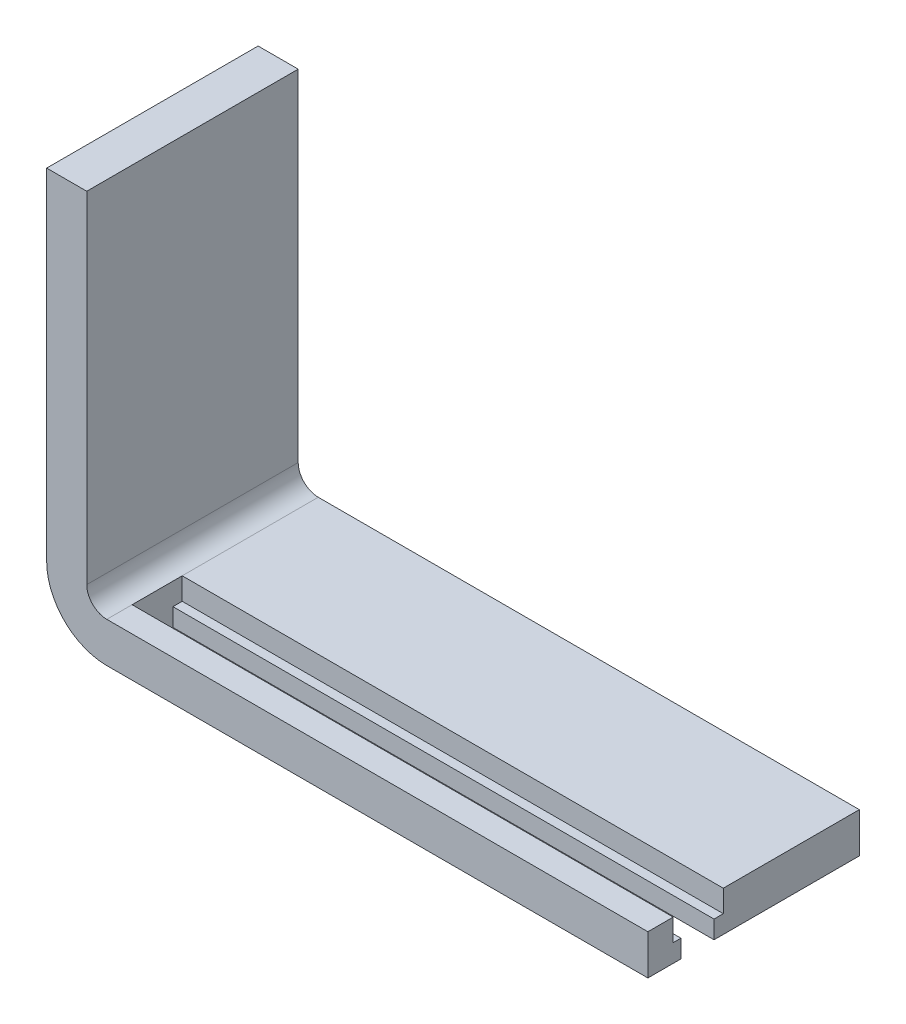
ISO-10303-21;
HEADER;
FILE_DESCRIPTION(('STEP AP214'),'2;1');
FILE_NAME('part.step','',(''),(''),'','','');
FILE_SCHEMA(('AUTOMOTIVE_DESIGN { 1 0 10303 214 1 1 1 1 }'));
ENDSEC;
DATA;
#1=APPLICATION_CONTEXT('core data for automotive mechanical design processes');
#2=APPLICATION_PROTOCOL_DEFINITION('international standard','automotive_design',2000,#1);
#3=PRODUCT_CONTEXT('',#1,'mechanical');
#4=PRODUCT('Part','Part','',(#3));
#5=PRODUCT_RELATED_PRODUCT_CATEGORY('part','',(#4));
#6=PRODUCT_DEFINITION_FORMATION('','',#4);
#7=PRODUCT_DEFINITION_CONTEXT('part definition',#1,'design');
#8=PRODUCT_DEFINITION('design','',#6,#7);
#9=PRODUCT_DEFINITION_SHAPE('','',#8);
#10=(LENGTH_UNIT() NAMED_UNIT(*) SI_UNIT(.MILLI.,.METRE.));
#11=(NAMED_UNIT(*) PLANE_ANGLE_UNIT() SI_UNIT($,.RADIAN.));
#12=(NAMED_UNIT(*) SI_UNIT($,.STERADIAN.) SOLID_ANGLE_UNIT());
#13=UNCERTAINTY_MEASURE_WITH_UNIT(LENGTH_MEASURE(1.E-05),#10,'distance_accuracy_value','');
#14=(GEOMETRIC_REPRESENTATION_CONTEXT(3) GLOBAL_UNCERTAINTY_ASSIGNED_CONTEXT((#13)) GLOBAL_UNIT_ASSIGNED_CONTEXT((#10,
#11,#12)) REPRESENTATION_CONTEXT('',''));
#15=CARTESIAN_POINT('',(0.,0.,0.));
#16=DIRECTION('',(0.,0.,1.));
#17=DIRECTION('',(1.,0.,0.));
#18=AXIS2_PLACEMENT_3D('',#15,#16,#17);
#19=CARTESIAN_POINT('',(0.,0.,0.));
#20=DIRECTION('',(0.,1.,0.));
#21=DIRECTION('',(0.,0.,1.));
#22=AXIS2_PLACEMENT_3D('',#19,#20,#21);
#23=PLANE('',#22);
#24=DIRECTION('',(1.,0.,0.));
#25=VECTOR('',#24,1.);
#26=CARTESIAN_POINT('',(-190.5,0.,-67.));
#27=LINE('',#26,#25);
#28=CARTESIAN_POINT('',(-190.5,0.,-67.));
#29=VERTEX_POINT('',#28);
#30=CARTESIAN_POINT('',(-177.8,0.,-67.));
#31=VERTEX_POINT('',#30);
#32=EDGE_CURVE('E258',#29,#31,#27,.T.);
#33=ORIENTED_EDGE('',*,*,#32,.F.);
#34=DIRECTION('',(0.,0.,-1.));
#35=VECTOR('',#34,1.);
#36=CARTESIAN_POINT('',(-190.5,0.,-127.));
#37=LINE('',#36,#35);
#38=CARTESIAN_POINT('',(-190.5,0.,0.));
#39=VERTEX_POINT('',#38);
#40=EDGE_CURVE('E116',#39,#29,#37,.T.);
#41=ORIENTED_EDGE('',*,*,#40,.F.);
#42=DIRECTION('',(1.,0.,0.));
#43=VECTOR('',#42,1.);
#44=CARTESIAN_POINT('',(0.,0.,0.));
#45=LINE('',#44,#43);
#46=CARTESIAN_POINT('',(-177.8,0.,0.));
#47=VERTEX_POINT('',#46);
#48=EDGE_CURVE('E120',#39,#47,#45,.T.);
#49=ORIENTED_EDGE('',*,*,#48,.T.);
#50=DIRECTION('',(0.,0.,1.));
#51=VECTOR('',#50,1.);
#52=CARTESIAN_POINT('',(-177.8,0.,-127.));
#53=LINE('',#52,#51);
#54=EDGE_CURVE('E112',#31,#47,#53,.T.);
#55=ORIENTED_EDGE('',*,*,#54,.F.);
#56=EDGE_LOOP('',(#33,#41,#49,#55));
#57=FACE_BOUND('',#56,.T.);
#58=ADVANCED_FACE('F39',(#57),#23,.T.);
#59=CARTESIAN_POINT('',(0.,0.,0.));
#60=DIRECTION('',(1.,0.,0.));
#61=DIRECTION('',(0.,0.,-1.));
#62=AXIS2_PLACEMENT_3D('',#59,#60,#61);
#63=PLANE('',#62);
#64=DIRECTION('',(0.,0.,-1.));
#65=VECTOR('',#64,1.);
#66=CARTESIAN_POINT('',(0.,-114.3,-127.));
#67=LINE('',#66,#65);
#68=CARTESIAN_POINT('',(0.,-114.3,0.));
#69=VERTEX_POINT('',#68);
#70=CARTESIAN_POINT('',(0.,-114.3,-8.01750000000001));
#71=VERTEX_POINT('',#70);
#72=EDGE_CURVE('E43',#69,#71,#67,.T.);
#73=ORIENTED_EDGE('',*,*,#72,.F.);
#74=DIRECTION('',(0.,-1.,0.));
#75=VECTOR('',#74,1.);
#76=CARTESIAN_POINT('',(0.,0.,0.));
#77=LINE('',#76,#75);
#78=CARTESIAN_POINT('',(0.,-127.,0.));
#79=VERTEX_POINT('',#78);
#80=EDGE_CURVE('E123',#69,#79,#77,.T.);
#81=ORIENTED_EDGE('',*,*,#80,.T.);
#82=DIRECTION('',(0.,0.,1.));
#83=VECTOR('',#82,1.);
#84=CARTESIAN_POINT('',(0.,-127.,-127.));
#85=LINE('',#84,#83);
#86=CARTESIAN_POINT('',(0.,-127.,-10.455));
#87=VERTEX_POINT('',#86);
#88=EDGE_CURVE('E119',#87,#79,#85,.T.);
#89=ORIENTED_EDGE('',*,*,#88,.F.);
#90=DIRECTION('',(0.,1.,0.));
#91=VECTOR('',#90,1.);
#92=CARTESIAN_POINT('',(0.,127.001,-10.455));
#93=LINE('',#92,#91);
#94=CARTESIAN_POINT('',(0.,-121.3,-10.455));
#95=VERTEX_POINT('',#94);
#96=EDGE_CURVE('E165',#87,#95,#93,.T.);
#97=ORIENTED_EDGE('',*,*,#96,.T.);
#98=DIRECTION('',(0.,0.,1.));
#99=VECTOR('',#98,1.);
#100=CARTESIAN_POINT('',(0.,-121.3,0.));
#101=LINE('',#100,#99);
#102=CARTESIAN_POINT('',(0.,-121.3,-8.01750000000001));
#103=VERTEX_POINT('',#102);
#104=EDGE_CURVE('E162',#95,#103,#101,.T.);
#105=ORIENTED_EDGE('',*,*,#104,.T.);
#106=DIRECTION('',(0.,1.,0.));
#107=VECTOR('',#106,1.);
#108=CARTESIAN_POINT('',(0.,-121.3,-8.01750000000001));
#109=LINE('',#108,#107);
#110=EDGE_CURVE('E159',#103,#71,#109,.T.);
#111=ORIENTED_EDGE('',*,*,#110,.T.);
#112=EDGE_LOOP('',(#73,#81,#89,#97,#105,#111));
#113=FACE_BOUND('',#112,.T.);
#114=ADVANCED_FACE('F195',(#113),#63,.T.);
#115=DIRECTION('',(0.,-1.,0.));
#116=VECTOR('',#115,1.);
#117=CARTESIAN_POINT('',(0.,-127.,-67.));
#118=LINE('',#117,#116);
#119=CARTESIAN_POINT('',(0.,-114.3,-67.));
#120=VERTEX_POINT('',#119);
#121=CARTESIAN_POINT('',(0.,-127.,-67.));
#122=VERTEX_POINT('',#121);
#123=EDGE_CURVE('E263',#120,#122,#118,.T.);
#124=ORIENTED_EDGE('',*,*,#123,.F.);
#125=DIRECTION('',(0.,0.,-1.));
#126=VECTOR('',#125,1.);
#127=CARTESIAN_POINT('',(0.,-114.3,-127.));
#128=LINE('',#127,#126);
#129=CARTESIAN_POINT('',(0.,-114.3,-23.8925));
#130=VERTEX_POINT('',#129);
#131=EDGE_CURVE('E175',#130,#120,#128,.T.);
#132=ORIENTED_EDGE('',*,*,#131,.F.);
#133=DIRECTION('',(0.,-1.,0.));
#134=VECTOR('',#133,1.);
#135=CARTESIAN_POINT('',(0.,-121.3,-23.8925));
#136=LINE('',#135,#134);
#137=CARTESIAN_POINT('',(0.,-121.3,-23.8925));
#138=VERTEX_POINT('',#137);
#139=EDGE_CURVE('E156',#130,#138,#136,.T.);
#140=ORIENTED_EDGE('',*,*,#139,.T.);
#141=DIRECTION('',(0.,0.,1.));
#142=VECTOR('',#141,1.);
#143=CARTESIAN_POINT('',(0.,-121.3,0.));
#144=LINE('',#143,#142);
#145=CARTESIAN_POINT('',(0.,-121.3,-20.955));
#146=VERTEX_POINT('',#145);
#147=EDGE_CURVE('E89',#138,#146,#144,.T.);
#148=ORIENTED_EDGE('',*,*,#147,.T.);
#149=DIRECTION('',(0.,-1.,0.));
#150=VECTOR('',#149,1.);
#151=CARTESIAN_POINT('',(0.,127.001,-20.955));
#152=LINE('',#151,#150);
#153=CARTESIAN_POINT('',(0.,-127.,-20.955));
#154=VERTEX_POINT('',#153);
#155=EDGE_CURVE('E124',#146,#154,#152,.T.);
#156=ORIENTED_EDGE('',*,*,#155,.T.);
#157=DIRECTION('',(0.,0.,1.));
#158=VECTOR('',#157,1.);
#159=CARTESIAN_POINT('',(0.,-127.,-127.));
#160=LINE('',#159,#158);
#161=EDGE_CURVE('E172',#122,#154,#160,.T.);
#162=ORIENTED_EDGE('',*,*,#161,.F.);
#163=EDGE_LOOP('',(#124,#132,#140,#148,#156,#162));
#164=FACE_BOUND('',#163,.T.);
#165=ADVANCED_FACE('F325',(#164),#63,.T.);
#166=CARTESIAN_POINT('',(-171.45,-107.95,-127.));
#167=DIRECTION('',(0.,0.,1.));
#168=DIRECTION('',(1.,0.,0.));
#169=AXIS2_PLACEMENT_3D('',#166,#167,#168);
#170=CYLINDRICAL_SURFACE('',#169,19.05);
#171=CARTESIAN_POINT('',(-171.45,-107.95,-67.));
#172=DIRECTION('',(0.,0.,1.));
#173=DIRECTION('',(1.,0.,0.));
#174=AXIS2_PLACEMENT_3D('',#171,#172,#173);
#175=CIRCLE('',#174,19.05);
#176=CARTESIAN_POINT('',(-171.45,-127.,-67.));
#177=VERTEX_POINT('',#176);
#178=CARTESIAN_POINT('',(-190.5,-107.95,-67.));
#179=VERTEX_POINT('',#178);
#180=EDGE_CURVE('E56',#177,#179,#175,.F.);
#181=ORIENTED_EDGE('',*,*,#180,.F.);
#182=DIRECTION('',(0.,0.,1.));
#183=VECTOR('',#182,1.);
#184=CARTESIAN_POINT('',(-171.45,-127.,-127.));
#185=LINE('',#184,#183);
#186=CARTESIAN_POINT('',(-171.45,-127.,-20.955));
#187=VERTEX_POINT('',#186);
#188=EDGE_CURVE('E210',#187,#177,#185,.F.);
#189=ORIENTED_EDGE('',*,*,#188,.F.);
#190=DIRECTION('',(0.,0.,-1.));
#191=VECTOR('',#190,1.);
#192=CARTESIAN_POINT('',(-171.45,-127.,-10.4550000000001));
#193=LINE('',#192,#191);
#194=CARTESIAN_POINT('',(-171.45,-127.,-10.4550000000001));
#195=VERTEX_POINT('',#194);
#196=EDGE_CURVE('E143',#195,#187,#193,.T.);
#197=ORIENTED_EDGE('',*,*,#196,.F.);
#198=CARTESIAN_POINT('',(-171.45,-127.,0.));
#199=VERTEX_POINT('',#198);
#200=EDGE_CURVE('E155',#199,#195,#185,.F.);
#201=ORIENTED_EDGE('',*,*,#200,.F.);
#202=CARTESIAN_POINT('',(-171.45,-107.95,0.));
#203=DIRECTION('',(0.,0.,-1.));
#204=DIRECTION('',(-1.,0.,0.));
#205=AXIS2_PLACEMENT_3D('',#202,#203,#204);
#206=CIRCLE('',#205,19.05);
#207=CARTESIAN_POINT('',(-190.5,-107.95,0.));
#208=VERTEX_POINT('',#207);
#209=EDGE_CURVE('E203',#208,#199,#206,.F.);
#210=ORIENTED_EDGE('',*,*,#209,.F.);
#211=DIRECTION('',(0.,0.,1.));
#212=VECTOR('',#211,1.);
#213=CARTESIAN_POINT('',(-190.5,-107.95,-127.));
#214=LINE('',#213,#212);
#215=EDGE_CURVE('E152',#179,#208,#214,.T.);
#216=ORIENTED_EDGE('',*,*,#215,.F.);
#217=EDGE_LOOP('',(#181,#189,#197,#201,#210,#216));
#218=FACE_BOUND('',#217,.T.);
#219=ADVANCED_FACE('F243',(#218),#170,.T.);
#220=CARTESIAN_POINT('',(-171.45,-107.95,-127.));
#221=DIRECTION('',(0.,0.,1.));
#222=DIRECTION('',(1.,0.,0.));
#223=AXIS2_PLACEMENT_3D('',#220,#221,#222);
#224=CYLINDRICAL_SURFACE('',#223,6.34999999999999);
#225=CARTESIAN_POINT('',(-171.45,-107.95,-67.));
#226=DIRECTION('',(0.,0.,1.));
#227=DIRECTION('',(1.,0.,0.));
#228=AXIS2_PLACEMENT_3D('',#225,#226,#227);
#229=CIRCLE('',#228,6.34999999999999);
#230=CARTESIAN_POINT('',(-177.8,-107.95,-67.));
#231=VERTEX_POINT('',#230);
#232=CARTESIAN_POINT('',(-171.45,-114.3,-67.));
#233=VERTEX_POINT('',#232);
#234=EDGE_CURVE('E249',#231,#233,#229,.T.);
#235=ORIENTED_EDGE('',*,*,#234,.F.);
#236=DIRECTION('',(0.,0.,1.));
#237=VECTOR('',#236,1.);
#238=CARTESIAN_POINT('',(-177.8,-107.95,-127.));
#239=LINE('',#238,#237);
#240=CARTESIAN_POINT('',(-177.8,-107.95,0.));
#241=VERTEX_POINT('',#240);
#242=EDGE_CURVE('E132',#231,#241,#239,.T.);
#243=ORIENTED_EDGE('',*,*,#242,.T.);
#244=CARTESIAN_POINT('',(-171.45,-107.95,0.));
#245=DIRECTION('',(0.,0.,-1.));
#246=DIRECTION('',(-1.,0.,0.));
#247=AXIS2_PLACEMENT_3D('',#244,#245,#246);
#248=CIRCLE('',#247,6.34999999999999);
#249=CARTESIAN_POINT('',(-171.45,-114.3,0.));
#250=VERTEX_POINT('',#249);
#251=EDGE_CURVE('E131',#250,#241,#248,.T.);
#252=ORIENTED_EDGE('',*,*,#251,.F.);
#253=DIRECTION('',(0.,0.,1.));
#254=VECTOR('',#253,1.);
#255=CARTESIAN_POINT('',(-171.45,-114.3,-127.));
#256=LINE('',#255,#254);
#257=CARTESIAN_POINT('',(-171.45,-114.3,-8.01750000000001));
#258=VERTEX_POINT('',#257);
#259=EDGE_CURVE('E220',#258,#250,#256,.T.);
#260=ORIENTED_EDGE('',*,*,#259,.F.);
#261=CARTESIAN_POINT('',(-171.45,-114.3,-23.8925));
#262=VERTEX_POINT('',#261);
#263=EDGE_CURVE('E219',#262,#258,#256,.T.);
#264=ORIENTED_EDGE('',*,*,#263,.F.);
#265=EDGE_CURVE('E65',#233,#262,#256,.T.);
#266=ORIENTED_EDGE('',*,*,#265,.F.);
#267=EDGE_LOOP('',(#235,#243,#252,#260,#264,#266));
#268=FACE_BOUND('',#267,.T.);
#269=ADVANCED_FACE('F340',(#268),#224,.F.);
#270=CARTESIAN_POINT('',(0.,0.,0.));
#271=DIRECTION('',(0.,0.,-1.));
#272=DIRECTION('',(-1.,0.,0.));
#273=AXIS2_PLACEMENT_3D('',#270,#271,#272);
#274=PLANE('',#273);
#275=ORIENTED_EDGE('',*,*,#80,.F.);
#276=DIRECTION('',(-1.,0.,0.));
#277=VECTOR('',#276,1.);
#278=CARTESIAN_POINT('',(158.75,-114.3,0.));
#279=LINE('',#278,#277);
#280=EDGE_CURVE('E147',#69,#250,#279,.T.);
#281=ORIENTED_EDGE('',*,*,#280,.T.);
#282=ORIENTED_EDGE('',*,*,#251,.T.);
#283=DIRECTION('',(0.,1.,0.));
#284=VECTOR('',#283,1.);
#285=CARTESIAN_POINT('',(-177.8,-107.95,0.));
#286=LINE('',#285,#284);
#287=EDGE_CURVE('E129',#241,#47,#286,.T.);
#288=ORIENTED_EDGE('',*,*,#287,.T.);
#289=ORIENTED_EDGE('',*,*,#48,.F.);
#290=DIRECTION('',(0.,-1.,0.));
#291=VECTOR('',#290,1.);
#292=CARTESIAN_POINT('',(-190.5,-127.,0.));
#293=LINE('',#292,#291);
#294=EDGE_CURVE('E125',#39,#208,#293,.T.);
#295=ORIENTED_EDGE('',*,*,#294,.T.);
#296=ORIENTED_EDGE('',*,*,#209,.T.);
#297=DIRECTION('',(1.,0.,0.));
#298=VECTOR('',#297,1.);
#299=CARTESIAN_POINT('',(-190.5,-127.,0.));
#300=LINE('',#299,#298);
#301=EDGE_CURVE('E128',#199,#79,#300,.T.);
#302=ORIENTED_EDGE('',*,*,#301,.T.);
#303=EDGE_LOOP('',(#275,#281,#282,#288,#289,#295,#296,#302));
#304=FACE_BOUND('',#303,.T.);
#305=ADVANCED_FACE('F201',(#304),#274,.F.);
#306=CARTESIAN_POINT('',(-177.8,-107.95,-127.));
#307=DIRECTION('',(1.,0.,0.));
#308=DIRECTION('',(0.,1.,0.));
#309=AXIS2_PLACEMENT_3D('',#306,#307,#308);
#310=PLANE('',#309);
#311=DIRECTION('',(0.,-1.,0.));
#312=VECTOR('',#311,1.);
#313=CARTESIAN_POINT('',(-177.8,-107.95,-67.));
#314=LINE('',#313,#312);
#315=EDGE_CURVE('E247',#31,#231,#314,.T.);
#316=ORIENTED_EDGE('',*,*,#315,.F.);
#317=ORIENTED_EDGE('',*,*,#54,.T.);
#318=ORIENTED_EDGE('',*,*,#287,.F.);
#319=ORIENTED_EDGE('',*,*,#242,.F.);
#320=EDGE_LOOP('',(#316,#317,#318,#319));
#321=FACE_BOUND('',#320,.T.);
#322=ADVANCED_FACE('F282',(#321),#310,.T.);
#323=CARTESIAN_POINT('',(-190.5,-127.,-127.));
#324=DIRECTION('',(0.,-1.,0.));
#325=DIRECTION('',(0.,0.,-1.));
#326=AXIS2_PLACEMENT_3D('',#323,#324,#325);
#327=PLANE('',#326);
#328=DIRECTION('',(1.,0.,0.));
#329=VECTOR('',#328,1.);
#330=CARTESIAN_POINT('',(-190.5,-127.,-67.));
#331=LINE('',#330,#329);
#332=EDGE_CURVE('E257',#177,#122,#331,.T.);
#333=ORIENTED_EDGE('',*,*,#332,.T.);
#334=ORIENTED_EDGE('',*,*,#161,.T.);
#335=DIRECTION('',(1.,0.,0.));
#336=VECTOR('',#335,1.);
#337=CARTESIAN_POINT('',(158.75,-127.,-20.955));
#338=LINE('',#337,#336);
#339=EDGE_CURVE('E144',#187,#154,#338,.T.);
#340=ORIENTED_EDGE('',*,*,#339,.F.);
#341=ORIENTED_EDGE('',*,*,#188,.T.);
#342=EDGE_LOOP('',(#333,#334,#340,#341));
#343=FACE_BOUND('',#342,.T.);
#344=ADVANCED_FACE('F238',(#343),#327,.T.);
#345=DIRECTION('',(-1.,0.,0.));
#346=VECTOR('',#345,1.);
#347=CARTESIAN_POINT('',(158.75,-127.,-10.455));
#348=LINE('',#347,#346);
#349=EDGE_CURVE('E139',#87,#195,#348,.T.);
#350=ORIENTED_EDGE('',*,*,#349,.F.);
#351=ORIENTED_EDGE('',*,*,#88,.T.);
#352=ORIENTED_EDGE('',*,*,#301,.F.);
#353=ORIENTED_EDGE('',*,*,#200,.T.);
#354=EDGE_LOOP('',(#350,#351,#352,#353));
#355=FACE_BOUND('',#354,.T.);
#356=ADVANCED_FACE('F183',(#355),#327,.T.);
#357=CARTESIAN_POINT('',(158.75,127.001,-10.455));
#358=DIRECTION('',(0.,0.,1.));
#359=DIRECTION('',(1.,0.,0.));
#360=AXIS2_PLACEMENT_3D('',#357,#358,#359);
#361=PLANE('',#360);
#362=ORIENTED_EDGE('',*,*,#96,.F.);
#363=ORIENTED_EDGE('',*,*,#349,.T.);
#364=DIRECTION('',(0.,-1.,0.));
#365=VECTOR('',#364,1.);
#366=CARTESIAN_POINT('',(-171.45,127.001,-10.4550000000001));
#367=LINE('',#366,#365);
#368=CARTESIAN_POINT('',(-171.45,-121.3,-10.455));
#369=VERTEX_POINT('',#368);
#370=EDGE_CURVE('E142',#369,#195,#367,.T.);
#371=ORIENTED_EDGE('',*,*,#370,.F.);
#372=DIRECTION('',(1.,0.,0.));
#373=VECTOR('',#372,1.);
#374=CARTESIAN_POINT('',(158.75,-121.3,-10.455));
#375=LINE('',#374,#373);
#376=EDGE_CURVE('E115',#369,#95,#375,.T.);
#377=ORIENTED_EDGE('',*,*,#376,.T.);
#378=EDGE_LOOP('',(#362,#363,#371,#377));
#379=FACE_BOUND('',#378,.T.);
#380=ADVANCED_FACE('F303',(#379),#361,.F.);
#381=CARTESIAN_POINT('',(158.75,-114.3,-127.));
#382=DIRECTION('',(0.,1.,0.));
#383=DIRECTION('',(0.,0.,1.));
#384=AXIS2_PLACEMENT_3D('',#381,#382,#383);
#385=PLANE('',#384);
#386=ORIENTED_EDGE('',*,*,#280,.F.);
#387=ORIENTED_EDGE('',*,*,#72,.T.);
#388=DIRECTION('',(1.,0.,0.));
#389=VECTOR('',#388,1.);
#390=CARTESIAN_POINT('',(-171.45,-114.3,-8.01750000000001));
#391=LINE('',#390,#389);
#392=EDGE_CURVE('E48',#258,#71,#391,.T.);
#393=ORIENTED_EDGE('',*,*,#392,.F.);
#394=ORIENTED_EDGE('',*,*,#259,.T.);
#395=EDGE_LOOP('',(#386,#387,#393,#394));
#396=FACE_BOUND('',#395,.T.);
#397=ADVANCED_FACE('F328',(#396),#385,.T.);
#398=CARTESIAN_POINT('',(158.75,127.001,-20.955));
#399=DIRECTION('',(0.,0.,-1.));
#400=DIRECTION('',(-1.,0.,0.));
#401=AXIS2_PLACEMENT_3D('',#398,#399,#400);
#402=PLANE('',#401);
#403=ORIENTED_EDGE('',*,*,#155,.F.);
#404=DIRECTION('',(-1.,0.,0.));
#405=VECTOR('',#404,1.);
#406=CARTESIAN_POINT('',(158.75,-121.3,-20.955));
#407=LINE('',#406,#405);
#408=CARTESIAN_POINT('',(-171.45,-121.3,-20.955));
#409=VERTEX_POINT('',#408);
#410=EDGE_CURVE('E136',#146,#409,#407,.T.);
#411=ORIENTED_EDGE('',*,*,#410,.T.);
#412=DIRECTION('',(0.,-1.,0.));
#413=VECTOR('',#412,1.);
#414=CARTESIAN_POINT('',(-171.45,127.001,-20.955));
#415=LINE('',#414,#413);
#416=EDGE_CURVE('E106',#409,#187,#415,.T.);
#417=ORIENTED_EDGE('',*,*,#416,.T.);
#418=ORIENTED_EDGE('',*,*,#339,.T.);
#419=EDGE_LOOP('',(#403,#411,#417,#418));
#420=FACE_BOUND('',#419,.T.);
#421=ADVANCED_FACE('F326',(#420),#402,.F.);
#422=CARTESIAN_POINT('',(0.,-121.3,0.));
#423=DIRECTION('',(0.,-1.,0.));
#424=DIRECTION('',(0.,0.,-1.));
#425=AXIS2_PLACEMENT_3D('',#422,#423,#424);
#426=PLANE('',#425);
#427=ORIENTED_EDGE('',*,*,#147,.F.);
#428=DIRECTION('',(-1.,0.,0.));
#429=VECTOR('',#428,1.);
#430=CARTESIAN_POINT('',(-171.45,-121.3,-23.8925));
#431=LINE('',#430,#429);
#432=CARTESIAN_POINT('',(-171.45,-121.3,-23.8925));
#433=VERTEX_POINT('',#432);
#434=EDGE_CURVE('E79',#138,#433,#431,.T.);
#435=ORIENTED_EDGE('',*,*,#434,.T.);
#436=DIRECTION('',(0.,0.,1.));
#437=VECTOR('',#436,1.);
#438=CARTESIAN_POINT('',(-171.45,-121.3,-8.01750000000001));
#439=LINE('',#438,#437);
#440=EDGE_CURVE('E85',#433,#409,#439,.T.);
#441=ORIENTED_EDGE('',*,*,#440,.T.);
#442=ORIENTED_EDGE('',*,*,#410,.F.);
#443=EDGE_LOOP('',(#427,#435,#441,#442));
#444=FACE_BOUND('',#443,.T.);
#445=ADVANCED_FACE('F81',(#444),#426,.F.);
#446=CARTESIAN_POINT('',(-171.45,127.001,-10.4550000000001));
#447=DIRECTION('',(-1.,0.,0.));
#448=DIRECTION('',(0.,0.,1.));
#449=AXIS2_PLACEMENT_3D('',#446,#447,#448);
#450=PLANE('',#449);
#451=ORIENTED_EDGE('',*,*,#416,.F.);
#452=ORIENTED_EDGE('',*,*,#440,.F.);
#453=DIRECTION('',(0.,1.,0.));
#454=VECTOR('',#453,1.);
#455=CARTESIAN_POINT('',(-171.45,-121.3,-23.8925));
#456=LINE('',#455,#454);
#457=EDGE_CURVE('E96',#433,#262,#456,.T.);
#458=ORIENTED_EDGE('',*,*,#457,.T.);
#459=ORIENTED_EDGE('',*,*,#263,.T.);
#460=DIRECTION('',(0.,1.,0.));
#461=VECTOR('',#460,1.);
#462=CARTESIAN_POINT('',(-171.45,-121.3,-8.01750000000001));
#463=LINE('',#462,#461);
#464=CARTESIAN_POINT('',(-171.45,-121.3,-8.01750000000001));
#465=VERTEX_POINT('',#464);
#466=EDGE_CURVE('E101',#465,#258,#463,.T.);
#467=ORIENTED_EDGE('',*,*,#466,.F.);
#468=EDGE_CURVE('E93',#369,#465,#439,.T.);
#469=ORIENTED_EDGE('',*,*,#468,.F.);
#470=ORIENTED_EDGE('',*,*,#370,.T.);
#471=ORIENTED_EDGE('',*,*,#196,.T.);
#472=EDGE_LOOP('',(#451,#452,#458,#459,#467,#469,#470,#471));
#473=FACE_BOUND('',#472,.T.);
#474=ADVANCED_FACE('F103',(#473),#450,.F.);
#475=DIRECTION('',(1.,0.,0.));
#476=VECTOR('',#475,1.);
#477=CARTESIAN_POINT('',(158.75,-114.3,-67.));
#478=LINE('',#477,#476);
#479=EDGE_CURVE('E254',#233,#120,#478,.T.);
#480=ORIENTED_EDGE('',*,*,#479,.F.);
#481=ORIENTED_EDGE('',*,*,#265,.T.);
#482=DIRECTION('',(-1.,0.,0.));
#483=VECTOR('',#482,1.);
#484=CARTESIAN_POINT('',(-171.45,-114.3,-23.8925));
#485=LINE('',#484,#483);
#486=EDGE_CURVE('E11',#130,#262,#485,.T.);
#487=ORIENTED_EDGE('',*,*,#486,.F.);
#488=ORIENTED_EDGE('',*,*,#131,.T.);
#489=EDGE_LOOP('',(#480,#481,#487,#488));
#490=FACE_BOUND('',#489,.T.);
#491=ADVANCED_FACE('F337',(#490),#385,.T.);
#492=CARTESIAN_POINT('',(-171.45,-121.3,-23.8925));
#493=DIRECTION('',(0.,0.,-1.));
#494=DIRECTION('',(-1.,0.,0.));
#495=AXIS2_PLACEMENT_3D('',#492,#493,#494);
#496=PLANE('',#495);
#497=ORIENTED_EDGE('',*,*,#139,.F.);
#498=ORIENTED_EDGE('',*,*,#486,.T.);
#499=ORIENTED_EDGE('',*,*,#457,.F.);
#500=ORIENTED_EDGE('',*,*,#434,.F.);
#501=EDGE_LOOP('',(#497,#498,#499,#500));
#502=FACE_BOUND('',#501,.T.);
#503=ADVANCED_FACE('F97',(#502),#496,.F.);
#504=ORIENTED_EDGE('',*,*,#104,.F.);
#505=ORIENTED_EDGE('',*,*,#376,.F.);
#506=ORIENTED_EDGE('',*,*,#468,.T.);
#507=DIRECTION('',(1.,0.,0.));
#508=VECTOR('',#507,1.);
#509=CARTESIAN_POINT('',(-171.45,-121.3,-8.01750000000001));
#510=LINE('',#509,#508);
#511=EDGE_CURVE('E100',#465,#103,#510,.T.);
#512=ORIENTED_EDGE('',*,*,#511,.T.);
#513=EDGE_LOOP('',(#504,#505,#506,#512));
#514=FACE_BOUND('',#513,.T.);
#515=ADVANCED_FACE('F297',(#514),#426,.F.);
#516=CARTESIAN_POINT('',(-171.45,-121.3,-8.01750000000001));
#517=DIRECTION('',(0.,0.,1.));
#518=DIRECTION('',(1.,0.,0.));
#519=AXIS2_PLACEMENT_3D('',#516,#517,#518);
#520=PLANE('',#519);
#521=ORIENTED_EDGE('',*,*,#110,.F.);
#522=ORIENTED_EDGE('',*,*,#511,.F.);
#523=ORIENTED_EDGE('',*,*,#466,.T.);
#524=ORIENTED_EDGE('',*,*,#392,.T.);
#525=EDGE_LOOP('',(#521,#522,#523,#524));
#526=FACE_BOUND('',#525,.T.);
#527=ADVANCED_FACE('F41',(#526),#520,.F.);
#528=CARTESIAN_POINT('',(-190.5,-127.,-127.));
#529=DIRECTION('',(-1.,0.,0.));
#530=DIRECTION('',(0.,0.,1.));
#531=AXIS2_PLACEMENT_3D('',#528,#529,#530);
#532=PLANE('',#531);
#533=DIRECTION('',(0.,-1.,0.));
#534=VECTOR('',#533,1.);
#535=CARTESIAN_POINT('',(-190.5,-127.,-67.));
#536=LINE('',#535,#534);
#537=EDGE_CURVE('E261',#29,#179,#536,.T.);
#538=ORIENTED_EDGE('',*,*,#537,.T.);
#539=ORIENTED_EDGE('',*,*,#215,.T.);
#540=ORIENTED_EDGE('',*,*,#294,.F.);
#541=ORIENTED_EDGE('',*,*,#40,.T.);
#542=EDGE_LOOP('',(#538,#539,#540,#541));
#543=FACE_BOUND('',#542,.T.);
#544=ADVANCED_FACE('F267',(#543),#532,.T.);
#545=CARTESIAN_POINT('',(-190.5,-127.,-67.));
#546=DIRECTION('',(0.,0.,1.));
#547=DIRECTION('',(1.,0.,0.));
#548=AXIS2_PLACEMENT_3D('',#545,#546,#547);
#549=PLANE('',#548);
#550=ORIENTED_EDGE('',*,*,#180,.T.);
#551=ORIENTED_EDGE('',*,*,#537,.F.);
#552=ORIENTED_EDGE('',*,*,#32,.T.);
#553=ORIENTED_EDGE('',*,*,#315,.T.);
#554=ORIENTED_EDGE('',*,*,#234,.T.);
#555=ORIENTED_EDGE('',*,*,#479,.T.);
#556=ORIENTED_EDGE('',*,*,#123,.T.);
#557=ORIENTED_EDGE('',*,*,#332,.F.);
#558=EDGE_LOOP('',(#550,#551,#552,#553,#554,#555,#556,#557));
#559=FACE_BOUND('',#558,.T.);
#560=ADVANCED_FACE('F271',(#559),#549,.F.);
#561=CLOSED_SHELL('',(#58,#114,#165,#219,#269,#305,#322,#344,#356,#380,#397,#421,#445,#474,#491,
#503,#515,#527,#544,#560));
#562=MANIFOLD_SOLID_BREP('B2',#561);
#563=ADVANCED_BREP_SHAPE_REPRESENTATION('',(#18,#562),#14);
#564=SHAPE_DEFINITION_REPRESENTATION(#9,#563);
ENDSEC;
END-ISO-10303-21;
